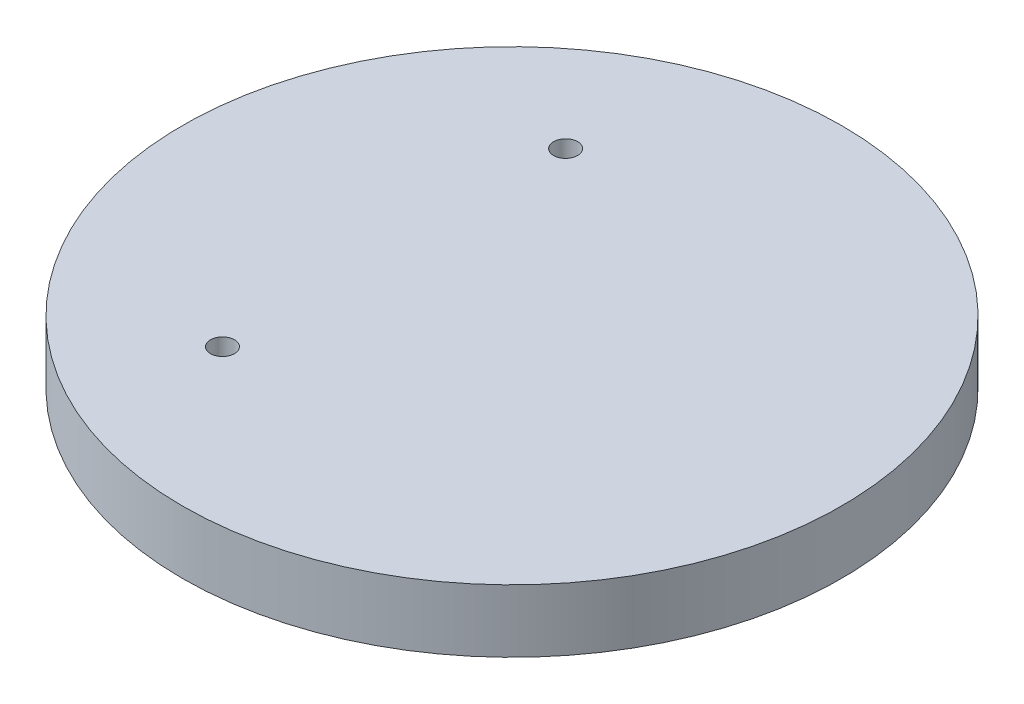
ISO-10303-21;
HEADER;
FILE_DESCRIPTION(('STEP AP214'),'2;1');
FILE_NAME('part.step','',(''),(''),'','','');
FILE_SCHEMA(('AUTOMOTIVE_DESIGN { 1 0 10303 214 1 1 1 1 }'));
ENDSEC;
DATA;
#1=APPLICATION_CONTEXT('core data for automotive mechanical design processes');
#2=APPLICATION_PROTOCOL_DEFINITION('international standard','automotive_design',2000,#1);
#3=PRODUCT_CONTEXT('',#1,'mechanical');
#4=PRODUCT('Part','Part','',(#3));
#5=PRODUCT_RELATED_PRODUCT_CATEGORY('part','',(#4));
#6=PRODUCT_DEFINITION_FORMATION('','',#4);
#7=PRODUCT_DEFINITION_CONTEXT('part definition',#1,'design');
#8=PRODUCT_DEFINITION('design','',#6,#7);
#9=PRODUCT_DEFINITION_SHAPE('','',#8);
#10=(LENGTH_UNIT() NAMED_UNIT(*) SI_UNIT(.MILLI.,.METRE.));
#11=(NAMED_UNIT(*) PLANE_ANGLE_UNIT() SI_UNIT($,.RADIAN.));
#12=(NAMED_UNIT(*) SI_UNIT($,.STERADIAN.) SOLID_ANGLE_UNIT());
#13=UNCERTAINTY_MEASURE_WITH_UNIT(LENGTH_MEASURE(1.E-05),#10,'distance_accuracy_value','');
#14=(GEOMETRIC_REPRESENTATION_CONTEXT(3) GLOBAL_UNCERTAINTY_ASSIGNED_CONTEXT((#13)) GLOBAL_UNIT_ASSIGNED_CONTEXT((#10,
#11,#12)) REPRESENTATION_CONTEXT('',''));
#15=CARTESIAN_POINT('',(0.,0.,0.));
#16=DIRECTION('',(0.,0.,1.));
#17=DIRECTION('',(1.,0.,0.));
#18=AXIS2_PLACEMENT_3D('',#15,#16,#17);
#19=CARTESIAN_POINT('',(0.,4.,0.));
#20=DIRECTION('',(0.,1.,0.));
#21=DIRECTION('',(0.,0.,1.));
#22=AXIS2_PLACEMENT_3D('',#19,#20,#21);
#23=PLANE('',#22);
#24=CARTESIAN_POINT('',(0.,4.,0.));
#25=DIRECTION('',(0.,-1.,0.));
#26=DIRECTION('',(0.,0.,-1.));
#27=AXIS2_PLACEMENT_3D('',#24,#25,#26);
#28=CIRCLE('',#27,2.43);
#29=CARTESIAN_POINT('',(0.,4.,-2.43));
#30=VERTEX_POINT('',#29);
#31=EDGE_CURVE('E49',#30,#30,#28,.T.);
#32=ORIENTED_EDGE('',*,*,#31,.T.);
#33=EDGE_LOOP('',(#32));
#34=FACE_BOUND('',#33,.T.);
#35=ADVANCED_FACE('F36',(#34),#23,.F.);
#36=CARTESIAN_POINT('',(0.,0.,0.));
#37=DIRECTION('',(0.,-1.,0.));
#38=DIRECTION('',(0.,0.,-1.));
#39=AXIS2_PLACEMENT_3D('',#36,#37,#38);
#40=CYLINDRICAL_SURFACE('',#39,2.43);
#41=ORIENTED_EDGE('',*,*,#31,.F.);
#42=EDGE_LOOP('',(#41));
#43=FACE_BOUND('',#42,.T.);
#44=CARTESIAN_POINT('',(0.,0.,0.));
#45=DIRECTION('',(0.,-1.,0.));
#46=DIRECTION('',(0.,0.,-1.));
#47=AXIS2_PLACEMENT_3D('',#44,#45,#46);
#48=CIRCLE('',#47,2.43);
#49=CARTESIAN_POINT('',(0.,0.,-2.43));
#50=VERTEX_POINT('',#49);
#51=EDGE_CURVE('E54',#50,#50,#48,.T.);
#52=ORIENTED_EDGE('',*,*,#51,.T.);
#53=EDGE_LOOP('',(#52));
#54=FACE_BOUND('',#53,.T.);
#55=ADVANCED_FACE('F118',(#43,#54),#40,.F.);
#56=CARTESIAN_POINT('',(-2.43,0.,0.));
#57=DIRECTION('',(0.,1.,0.));
#58=DIRECTION('',(0.,0.,1.));
#59=AXIS2_PLACEMENT_3D('',#56,#57,#58);
#60=PLANE('',#59);
#61=ORIENTED_EDGE('',*,*,#51,.F.);
#62=EDGE_LOOP('',(#61));
#63=FACE_BOUND('',#62,.T.);
#64=CARTESIAN_POINT('',(0.,0.,0.));
#65=DIRECTION('',(0.,-1.,0.));
#66=DIRECTION('',(0.,0.,-1.));
#67=AXIS2_PLACEMENT_3D('',#64,#65,#66);
#68=CIRCLE('',#67,4.43);
#69=CARTESIAN_POINT('',(0.,0.,-4.43));
#70=VERTEX_POINT('',#69);
#71=EDGE_CURVE('E60',#70,#70,#68,.T.);
#72=ORIENTED_EDGE('',*,*,#71,.T.);
#73=EDGE_LOOP('',(#72));
#74=FACE_BOUND('',#73,.T.);
#75=ADVANCED_FACE('F124',(#63,#74),#60,.F.);
#76=CARTESIAN_POINT('',(-4.43,4.,0.));
#77=DIRECTION('',(0.,1.,0.));
#78=DIRECTION('',(0.,0.,1.));
#79=AXIS2_PLACEMENT_3D('',#76,#77,#78);
#80=PLANE('',#79);
#81=CARTESIAN_POINT('',(-11.275,4.,16.4));
#82=DIRECTION('',(0.,1.,0.));
#83=DIRECTION('',(0.,0.,1.));
#84=AXIS2_PLACEMENT_3D('',#81,#82,#83);
#85=CIRCLE('',#84,1.15);
#86=CARTESIAN_POINT('',(-11.275,4.,17.55));
#87=VERTEX_POINT('',#86);
#88=EDGE_CURVE('E76',#87,#87,#85,.T.);
#89=ORIENTED_EDGE('',*,*,#88,.T.);
#90=EDGE_LOOP('',(#89));
#91=FACE_BOUND('',#90,.T.);
#92=CARTESIAN_POINT('',(-11.275,4.,-16.4));
#93=DIRECTION('',(0.,1.,0.));
#94=DIRECTION('',(0.,0.,1.));
#95=AXIS2_PLACEMENT_3D('',#92,#93,#94);
#96=CIRCLE('',#95,1.15);
#97=CARTESIAN_POINT('',(-11.275,4.,-15.25));
#98=VERTEX_POINT('',#97);
#99=EDGE_CURVE('E80',#98,#98,#96,.T.);
#100=ORIENTED_EDGE('',*,*,#99,.T.);
#101=EDGE_LOOP('',(#100));
#102=FACE_BOUND('',#101,.T.);
#103=CARTESIAN_POINT('',(0.,4.,0.));
#104=DIRECTION('',(0.,1.,0.));
#105=DIRECTION('',(0.,0.,1.));
#106=AXIS2_PLACEMENT_3D('',#103,#104,#105);
#107=CIRCLE('',#106,12.43);
#108=CARTESIAN_POINT('',(0.,4.,12.43));
#109=VERTEX_POINT('',#108);
#110=EDGE_CURVE('E10',#109,#109,#107,.T.);
#111=ORIENTED_EDGE('',*,*,#110,.T.);
#112=EDGE_LOOP('',(#111));
#113=FACE_BOUND('',#112,.T.);
#114=CARTESIAN_POINT('',(0.,4.,0.));
#115=DIRECTION('',(0.,1.,0.));
#116=DIRECTION('',(0.,0.,1.));
#117=AXIS2_PLACEMENT_3D('',#114,#115,#116);
#118=CIRCLE('',#117,21.5);
#119=CARTESIAN_POINT('',(0.,4.,21.5));
#120=VERTEX_POINT('',#119);
#121=EDGE_CURVE('E44',#120,#120,#118,.F.);
#122=ORIENTED_EDGE('',*,*,#121,.T.);
#123=EDGE_LOOP('',(#122));
#124=FACE_BOUND('',#123,.T.);
#125=ADVANCED_FACE('F113',(#91,#102,#113,#124),#80,.F.);
#126=CARTESIAN_POINT('',(-29.5,0.,0.));
#127=DIRECTION('',(0.,1.,0.));
#128=DIRECTION('',(0.,0.,1.));
#129=AXIS2_PLACEMENT_3D('',#126,#127,#128);
#130=PLANE('',#129);
#131=CARTESIAN_POINT('',(0.,0.,0.));
#132=DIRECTION('',(0.,-1.,0.));
#133=DIRECTION('',(0.,0.,-1.));
#134=AXIS2_PLACEMENT_3D('',#131,#132,#133);
#135=CIRCLE('',#134,29.5);
#136=CARTESIAN_POINT('',(0.,0.,-29.5));
#137=VERTEX_POINT('',#136);
#138=EDGE_CURVE('E64',#137,#137,#135,.T.);
#139=ORIENTED_EDGE('',*,*,#138,.F.);
#140=EDGE_LOOP('',(#139));
#141=FACE_BOUND('',#140,.T.);
#142=CARTESIAN_POINT('',(0.,0.,0.));
#143=DIRECTION('',(0.,-1.,0.));
#144=DIRECTION('',(0.,0.,-1.));
#145=AXIS2_PLACEMENT_3D('',#142,#143,#144);
#146=CIRCLE('',#145,31.5);
#147=CARTESIAN_POINT('',(0.,0.,-31.5));
#148=VERTEX_POINT('',#147);
#149=EDGE_CURVE('E68',#148,#148,#146,.T.);
#150=ORIENTED_EDGE('',*,*,#149,.T.);
#151=EDGE_LOOP('',(#150));
#152=FACE_BOUND('',#151,.T.);
#153=ADVANCED_FACE('F107',(#141,#152),#130,.F.);
#154=CARTESIAN_POINT('',(0.,0.,0.));
#155=DIRECTION('',(0.,-1.,0.));
#156=DIRECTION('',(0.,0.,-1.));
#157=AXIS2_PLACEMENT_3D('',#154,#155,#156);
#158=CYLINDRICAL_SURFACE('',#157,31.5);
#159=ORIENTED_EDGE('',*,*,#149,.F.);
#160=EDGE_LOOP('',(#159));
#161=FACE_BOUND('',#160,.T.);
#162=CARTESIAN_POINT('',(0.,6.,0.));
#163=DIRECTION('',(0.,-1.,0.));
#164=DIRECTION('',(0.,0.,-1.));
#165=AXIS2_PLACEMENT_3D('',#162,#163,#164);
#166=CIRCLE('',#165,31.5);
#167=CARTESIAN_POINT('',(0.,6.,-31.5));
#168=VERTEX_POINT('',#167);
#169=EDGE_CURVE('E72',#168,#168,#166,.T.);
#170=ORIENTED_EDGE('',*,*,#169,.T.);
#171=EDGE_LOOP('',(#170));
#172=FACE_BOUND('',#171,.T.);
#173=ADVANCED_FACE('F100',(#161,#172),#158,.T.);
#174=CARTESIAN_POINT('',(-31.5,6.,0.));
#175=DIRECTION('',(0.,-1.,0.));
#176=DIRECTION('',(0.,0.,-1.));
#177=AXIS2_PLACEMENT_3D('',#174,#175,#176);
#178=PLANE('',#177);
#179=CARTESIAN_POINT('',(-11.275,6.,16.4));
#180=DIRECTION('',(0.,1.,0.));
#181=DIRECTION('',(0.,0.,1.));
#182=AXIS2_PLACEMENT_3D('',#179,#180,#181);
#183=CIRCLE('',#182,1.15);
#184=CARTESIAN_POINT('',(-11.275,6.,17.55));
#185=VERTEX_POINT('',#184);
#186=EDGE_CURVE('E84',#185,#185,#183,.T.);
#187=ORIENTED_EDGE('',*,*,#186,.F.);
#188=EDGE_LOOP('',(#187));
#189=FACE_BOUND('',#188,.T.);
#190=CARTESIAN_POINT('',(-11.275,6.,-16.4));
#191=DIRECTION('',(0.,1.,0.));
#192=DIRECTION('',(0.,0.,1.));
#193=AXIS2_PLACEMENT_3D('',#190,#191,#192);
#194=CIRCLE('',#193,1.15);
#195=CARTESIAN_POINT('',(-11.275,6.,-15.25));
#196=VERTEX_POINT('',#195);
#197=EDGE_CURVE('E85',#196,#196,#194,.T.);
#198=ORIENTED_EDGE('',*,*,#197,.F.);
#199=EDGE_LOOP('',(#198));
#200=FACE_BOUND('',#199,.T.);
#201=ORIENTED_EDGE('',*,*,#169,.F.);
#202=EDGE_LOOP('',(#201));
#203=FACE_BOUND('',#202,.T.);
#204=ADVANCED_FACE('F96',(#189,#200,#203),#178,.F.);
#205=CARTESIAN_POINT('',(0.,-6.,0.));
#206=DIRECTION('',(0.,1.,0.));
#207=DIRECTION('',(0.,0.,1.));
#208=AXIS2_PLACEMENT_3D('',#205,#206,#207);
#209=TOROIDAL_SURFACE('',#208,12.43,10.);
#210=ORIENTED_EDGE('',*,*,#110,.F.);
#211=EDGE_LOOP('',(#210));
#212=FACE_BOUND('',#211,.T.);
#213=ORIENTED_EDGE('',*,*,#71,.F.);
#214=EDGE_LOOP('',(#213));
#215=FACE_BOUND('',#214,.T.);
#216=ADVANCED_FACE('F99',(#212,#215),#209,.F.);
#217=CARTESIAN_POINT('',(0.,-6.,0.));
#218=DIRECTION('',(0.,-1.,0.));
#219=DIRECTION('',(0.,0.,-1.));
#220=AXIS2_PLACEMENT_3D('',#217,#218,#219);
#221=TOROIDAL_SURFACE('',#220,21.5,10.);
#222=ORIENTED_EDGE('',*,*,#138,.T.);
#223=EDGE_LOOP('',(#222));
#224=FACE_BOUND('',#223,.T.);
#225=ORIENTED_EDGE('',*,*,#121,.F.);
#226=EDGE_LOOP('',(#225));
#227=FACE_BOUND('',#226,.T.);
#228=ADVANCED_FACE('F38',(#224,#227),#221,.F.);
#229=CARTESIAN_POINT('',(-11.275,-4.,-16.4));
#230=DIRECTION('',(0.,1.,0.));
#231=DIRECTION('',(0.,0.,1.));
#232=AXIS2_PLACEMENT_3D('',#229,#230,#231);
#233=CYLINDRICAL_SURFACE('',#232,1.15);
#234=ORIENTED_EDGE('',*,*,#197,.T.);
#235=EDGE_LOOP('',(#234));
#236=FACE_BOUND('',#235,.T.);
#237=ORIENTED_EDGE('',*,*,#99,.F.);
#238=EDGE_LOOP('',(#237));
#239=FACE_BOUND('',#238,.T.);
#240=ADVANCED_FACE('F133',(#236,#239),#233,.F.);
#241=CARTESIAN_POINT('',(-11.275,-4.,16.4));
#242=DIRECTION('',(0.,1.,0.));
#243=DIRECTION('',(0.,0.,1.));
#244=AXIS2_PLACEMENT_3D('',#241,#242,#243);
#245=CYLINDRICAL_SURFACE('',#244,1.15);
#246=ORIENTED_EDGE('',*,*,#186,.T.);
#247=EDGE_LOOP('',(#246));
#248=FACE_BOUND('',#247,.T.);
#249=ORIENTED_EDGE('',*,*,#88,.F.);
#250=EDGE_LOOP('',(#249));
#251=FACE_BOUND('',#250,.T.);
#252=ADVANCED_FACE('F93',(#248,#251),#245,.F.);
#253=CLOSED_SHELL('',(#35,#55,#75,#125,#153,#173,#204,#216,#228,#240,#252));
#254=MANIFOLD_SOLID_BREP('B2',#253);
#255=ADVANCED_BREP_SHAPE_REPRESENTATION('',(#18,#254),#14);
#256=SHAPE_DEFINITION_REPRESENTATION(#9,#255);
ENDSEC;
END-ISO-10303-21;
